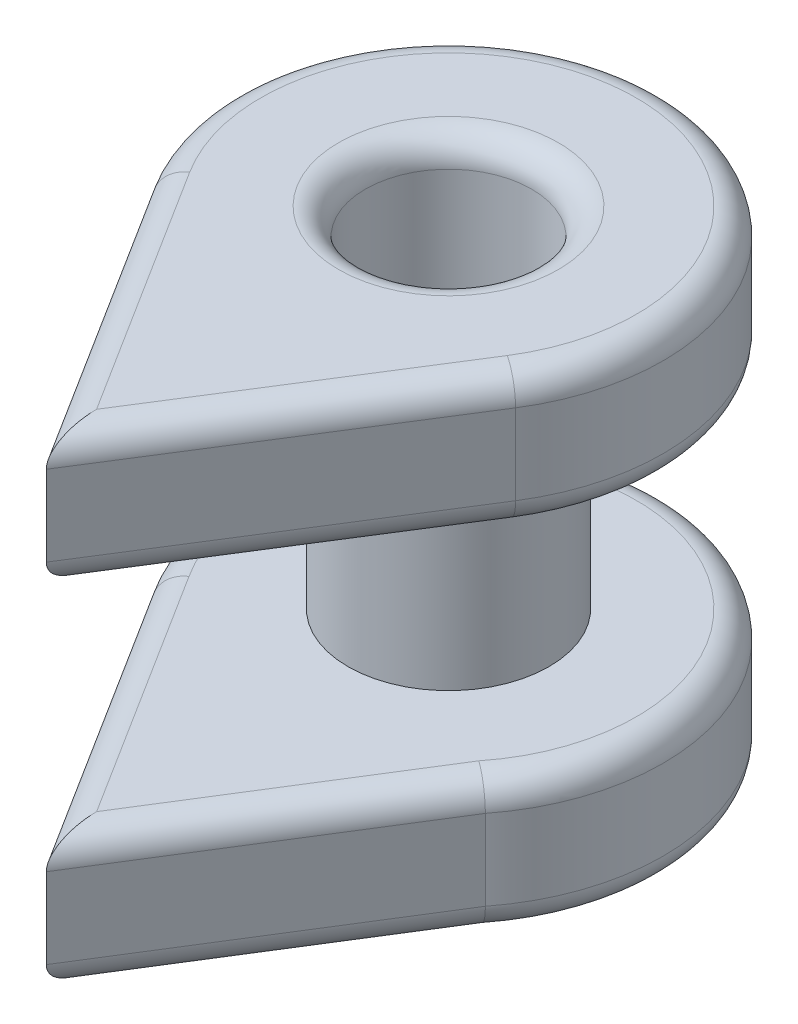
ISO-10303-21;
HEADER;
FILE_DESCRIPTION(('STEP AP214'),'2;1');
FILE_NAME('part.step','',(''),(''),'','','');
FILE_SCHEMA(('AUTOMOTIVE_DESIGN { 1 0 10303 214 1 1 1 1 }'));
ENDSEC;
DATA;
#1=APPLICATION_CONTEXT('core data for automotive mechanical design processes');
#2=APPLICATION_PROTOCOL_DEFINITION('international standard','automotive_design',2000,#1);
#3=PRODUCT_CONTEXT('',#1,'mechanical');
#4=PRODUCT('Part','Part','',(#3));
#5=PRODUCT_RELATED_PRODUCT_CATEGORY('part','',(#4));
#6=PRODUCT_DEFINITION_FORMATION('','',#4);
#7=PRODUCT_DEFINITION_CONTEXT('part definition',#1,'design');
#8=PRODUCT_DEFINITION('design','',#6,#7);
#9=PRODUCT_DEFINITION_SHAPE('','',#8);
#10=(LENGTH_UNIT() NAMED_UNIT(*) SI_UNIT(.MILLI.,.METRE.));
#11=(NAMED_UNIT(*) PLANE_ANGLE_UNIT() SI_UNIT($,.RADIAN.));
#12=(NAMED_UNIT(*) SI_UNIT($,.STERADIAN.) SOLID_ANGLE_UNIT());
#13=UNCERTAINTY_MEASURE_WITH_UNIT(LENGTH_MEASURE(1.E-05),#10,'distance_accuracy_value','');
#14=(GEOMETRIC_REPRESENTATION_CONTEXT(3) GLOBAL_UNCERTAINTY_ASSIGNED_CONTEXT((#13)) GLOBAL_UNIT_ASSIGNED_CONTEXT((#10,
#11,#12)) REPRESENTATION_CONTEXT('',''));
#15=CARTESIAN_POINT('',(0.,0.,0.));
#16=DIRECTION('',(0.,0.,1.));
#17=DIRECTION('',(1.,0.,0.));
#18=AXIS2_PLACEMENT_3D('',#15,#16,#17);
#19=CARTESIAN_POINT('',(0.,8.,0.));
#20=DIRECTION('',(0.,-1.,0.));
#21=DIRECTION('',(0.,0.,-1.));
#22=AXIS2_PLACEMENT_3D('',#19,#20,#21);
#23=CYLINDRICAL_SURFACE('',#22,3.75);
#24=CARTESIAN_POINT('',(0.,8.,0.));
#25=DIRECTION('',(0.,1.,0.));
#26=DIRECTION('',(0.,0.,1.));
#27=AXIS2_PLACEMENT_3D('',#24,#25,#26);
#28=CIRCLE('',#27,3.75);
#29=CARTESIAN_POINT('',(0.,8.,3.75));
#30=VERTEX_POINT('',#29);
#31=EDGE_CURVE('E181',#30,#30,#28,.T.);
#32=ORIENTED_EDGE('',*,*,#31,.F.);
#33=EDGE_LOOP('',(#32));
#34=FACE_BOUND('',#33,.T.);
#35=CARTESIAN_POINT('',(0.,0.,0.));
#36=DIRECTION('',(0.,1.,0.));
#37=DIRECTION('',(0.,0.,1.));
#38=AXIS2_PLACEMENT_3D('',#35,#36,#37);
#39=CIRCLE('',#38,3.75);
#40=CARTESIAN_POINT('',(0.,0.,3.75));
#41=VERTEX_POINT('',#40);
#42=EDGE_CURVE('E163',#41,#41,#39,.T.);
#43=ORIENTED_EDGE('',*,*,#42,.T.);
#44=EDGE_LOOP('',(#43));
#45=FACE_BOUND('',#44,.T.);
#46=ADVANCED_FACE('F45',(#34,#45),#23,.T.);
#47=CARTESIAN_POINT('',(0.,8.,0.));
#48=DIRECTION('',(0.,-1.,0.));
#49=DIRECTION('',(0.,0.,-1.));
#50=AXIS2_PLACEMENT_3D('',#47,#48,#49);
#51=CYLINDRICAL_SURFACE('',#50,3.1);
#52=CARTESIAN_POINT('',(0.,-4.,0.));
#53=DIRECTION('',(0.,-1.,0.));
#54=DIRECTION('',(0.,0.,-1.));
#55=AXIS2_PLACEMENT_3D('',#52,#53,#54);
#56=CIRCLE('',#55,3.1);
#57=CARTESIAN_POINT('',(0.,-4.,-3.1));
#58=VERTEX_POINT('',#57);
#59=EDGE_CURVE('E54',#58,#58,#56,.T.);
#60=ORIENTED_EDGE('',*,*,#59,.T.);
#61=EDGE_LOOP('',(#60));
#62=FACE_BOUND('',#61,.T.);
#63=CARTESIAN_POINT('',(0.,12.,0.));
#64=DIRECTION('',(0.,1.,0.));
#65=DIRECTION('',(0.,0.,1.));
#66=AXIS2_PLACEMENT_3D('',#63,#64,#65);
#67=CIRCLE('',#66,3.1);
#68=CARTESIAN_POINT('',(0.,12.,3.1));
#69=VERTEX_POINT('',#68);
#70=EDGE_CURVE('E633',#69,#69,#67,.T.);
#71=ORIENTED_EDGE('',*,*,#70,.T.);
#72=EDGE_LOOP('',(#71));
#73=FACE_BOUND('',#72,.T.);
#74=ADVANCED_FACE('F307',(#62,#73),#51,.F.);
#75=CARTESIAN_POINT('',(6.76724135490641,13.,4.26666666666667));
#76=DIRECTION('',(-0.845905169363301,0.,-0.533333333333333));
#77=DIRECTION('',(-0.533333333333333,0.,0.845905169363302));
#78=AXIS2_PLACEMENT_3D('',#75,#76,#77);
#79=PLANE('',#78);
#80=DIRECTION('',(0.,-1.,0.));
#81=VECTOR('',#80,1.);
#82=CARTESIAN_POINT('',(0.,13.,15.));
#83=LINE('',#82,#81);
#84=CARTESIAN_POINT('',(0.,12.,15.));
#85=VERTEX_POINT('',#84);
#86=CARTESIAN_POINT('',(0.,9.,15.));
#87=VERTEX_POINT('',#86);
#88=EDGE_CURVE('E143',#85,#87,#83,.T.);
#89=ORIENTED_EDGE('',*,*,#88,.T.);
#90=DIRECTION('',(0.533333333333333,0.,-0.845905169363302));
#91=VECTOR('',#90,1.);
#92=CARTESIAN_POINT('',(6.76724135490641,9.,4.26666666666667));
#93=LINE('',#92,#91);
#94=CARTESIAN_POINT('',(6.76724135490641,9.,4.26666666666667));
#95=VERTEX_POINT('',#94);
#96=EDGE_CURVE('E651',#87,#95,#93,.T.);
#97=ORIENTED_EDGE('',*,*,#96,.T.);
#98=DIRECTION('',(0.,-1.,0.));
#99=VECTOR('',#98,1.);
#100=CARTESIAN_POINT('',(6.76724135490641,13.,4.26666666666667));
#101=LINE('',#100,#99);
#102=CARTESIAN_POINT('',(6.76724135490641,12.,4.26666666666667));
#103=VERTEX_POINT('',#102);
#104=EDGE_CURVE('E145',#103,#95,#101,.T.);
#105=ORIENTED_EDGE('',*,*,#104,.F.);
#106=DIRECTION('',(0.533333333333333,0.,-0.845905169363302));
#107=VECTOR('',#106,1.);
#108=CARTESIAN_POINT('',(0.,12.,15.));
#109=LINE('',#108,#107);
#110=EDGE_CURVE('E139',#103,#85,#109,.F.);
#111=ORIENTED_EDGE('',*,*,#110,.T.);
#112=EDGE_LOOP('',(#89,#97,#105,#111));
#113=FACE_BOUND('',#112,.T.);
#114=ADVANCED_FACE('F141',(#113),#79,.F.);
#115=CARTESIAN_POINT('',(0.,13.,0.));
#116=DIRECTION('',(0.,-1.,0.));
#117=DIRECTION('',(0.,0.,-1.));
#118=AXIS2_PLACEMENT_3D('',#115,#116,#117);
#119=CYLINDRICAL_SURFACE('',#118,8.);
#120=ORIENTED_EDGE('',*,*,#104,.T.);
#121=CARTESIAN_POINT('',(0.,9.,0.));
#122=DIRECTION('',(0.,1.,0.));
#123=DIRECTION('',(0.,0.,1.));
#124=AXIS2_PLACEMENT_3D('',#121,#122,#123);
#125=CIRCLE('',#124,8.);
#126=CARTESIAN_POINT('',(-6.76724135490641,9.,4.26666666666667));
#127=VERTEX_POINT('',#126);
#128=EDGE_CURVE('E61',#95,#127,#125,.T.);
#129=ORIENTED_EDGE('',*,*,#128,.T.);
#130=DIRECTION('',(0.,-1.,0.));
#131=VECTOR('',#130,1.);
#132=CARTESIAN_POINT('',(-6.76724135490641,13.,4.26666666666667));
#133=LINE('',#132,#131);
#134=CARTESIAN_POINT('',(-6.76724135490641,12.,4.26666666666667));
#135=VERTEX_POINT('',#134);
#136=EDGE_CURVE('E162',#135,#127,#133,.T.);
#137=ORIENTED_EDGE('',*,*,#136,.F.);
#138=CARTESIAN_POINT('',(0.,12.,0.));
#139=DIRECTION('',(0.,1.,0.));
#140=DIRECTION('',(0.,0.,1.));
#141=AXIS2_PLACEMENT_3D('',#138,#139,#140);
#142=CIRCLE('',#141,8.);
#143=EDGE_CURVE('E151',#135,#103,#142,.F.);
#144=ORIENTED_EDGE('',*,*,#143,.T.);
#145=EDGE_LOOP('',(#120,#129,#137,#144));
#146=FACE_BOUND('',#145,.T.);
#147=ADVANCED_FACE('F356',(#146),#119,.T.);
#148=CARTESIAN_POINT('',(-6.76724135490641,13.,4.26666666666667));
#149=DIRECTION('',(-0.845905169363301,0.,0.533333333333333));
#150=DIRECTION('',(0.533333333333333,0.,0.845905169363301));
#151=AXIS2_PLACEMENT_3D('',#148,#149,#150);
#152=PLANE('',#151);
#153=ORIENTED_EDGE('',*,*,#136,.T.);
#154=DIRECTION('',(-0.533333333333333,0.,-0.845905169363301));
#155=VECTOR('',#154,1.);
#156=CARTESIAN_POINT('',(0.,9.,15.));
#157=LINE('',#156,#155);
#158=EDGE_CURVE('E160',#127,#87,#157,.F.);
#159=ORIENTED_EDGE('',*,*,#158,.T.);
#160=ORIENTED_EDGE('',*,*,#88,.F.);
#161=DIRECTION('',(-0.533333333333333,0.,-0.845905169363301));
#162=VECTOR('',#161,1.);
#163=CARTESIAN_POINT('',(-6.76724135490641,12.,4.26666666666667));
#164=LINE('',#163,#162);
#165=EDGE_CURVE('E158',#85,#135,#164,.T.);
#166=ORIENTED_EDGE('',*,*,#165,.T.);
#167=EDGE_LOOP('',(#153,#159,#160,#166));
#168=FACE_BOUND('',#167,.T.);
#169=ADVANCED_FACE('F156',(#168),#152,.T.);
#170=CARTESIAN_POINT('',(0.,13.,0.));
#171=DIRECTION('',(0.,1.,0.));
#172=DIRECTION('',(0.,0.,1.));
#173=AXIS2_PLACEMENT_3D('',#170,#171,#172);
#174=PLANE('',#173);
#175=CARTESIAN_POINT('',(0.,13.,0.));
#176=DIRECTION('',(0.,1.,0.));
#177=DIRECTION('',(0.,0.,1.));
#178=AXIS2_PLACEMENT_3D('',#175,#176,#177);
#179=CIRCLE('',#178,4.1);
#180=CARTESIAN_POINT('',(0.,13.,4.1));
#181=VERTEX_POINT('',#180);
#182=EDGE_CURVE('E621',#181,#181,#179,.F.);
#183=ORIENTED_EDGE('',*,*,#182,.T.);
#184=EDGE_LOOP('',(#183));
#185=FACE_BOUND('',#184,.T.);
#186=CARTESIAN_POINT('',(0.,13.,0.));
#187=DIRECTION('',(0.,1.,0.));
#188=DIRECTION('',(0.,0.,1.));
#189=AXIS2_PLACEMENT_3D('',#186,#187,#188);
#190=CIRCLE('',#189,7.);
#191=CARTESIAN_POINT('',(5.92133618554311,13.,3.73333333333333));
#192=VERTEX_POINT('',#191);
#193=CARTESIAN_POINT('',(-5.92133618554311,13.,3.73333333333333));
#194=VERTEX_POINT('',#193);
#195=EDGE_CURVE('E180',#192,#194,#190,.T.);
#196=ORIENTED_EDGE('',*,*,#195,.T.);
#197=DIRECTION('',(-0.533333333333333,0.,-0.845905169363301));
#198=VECTOR('',#197,1.);
#199=CARTESIAN_POINT('',(-5.92133618554311,13.,3.73333333333333));
#200=LINE('',#199,#198);
#201=CARTESIAN_POINT('',(0.,13.,13.125));
#202=VERTEX_POINT('',#201);
#203=EDGE_CURVE('E152',#194,#202,#200,.F.);
#204=ORIENTED_EDGE('',*,*,#203,.T.);
#205=DIRECTION('',(0.533333333333333,0.,-0.845905169363302));
#206=VECTOR('',#205,1.);
#207=CARTESIAN_POINT('',(5.92133618554311,13.,3.73333333333334));
#208=LINE('',#207,#206);
#209=EDGE_CURVE('E168',#202,#192,#208,.T.);
#210=ORIENTED_EDGE('',*,*,#209,.T.);
#211=EDGE_LOOP('',(#196,#204,#210));
#212=FACE_BOUND('',#211,.T.);
#213=ADVANCED_FACE('F346',(#185,#212),#174,.T.);
#214=CARTESIAN_POINT('',(0.,8.,0.));
#215=DIRECTION('',(0.,1.,0.));
#216=DIRECTION('',(0.,0.,1.));
#217=AXIS2_PLACEMENT_3D('',#214,#215,#216);
#218=PLANE('',#217);
#219=CARTESIAN_POINT('',(0.,8.,0.));
#220=DIRECTION('',(0.,1.,0.));
#221=DIRECTION('',(0.,0.,1.));
#222=AXIS2_PLACEMENT_3D('',#219,#220,#221);
#223=CIRCLE('',#222,7.);
#224=CARTESIAN_POINT('',(-5.92133618554311,8.,3.73333333333333));
#225=VERTEX_POINT('',#224);
#226=CARTESIAN_POINT('',(5.92133618554311,8.,3.73333333333333));
#227=VERTEX_POINT('',#226);
#228=EDGE_CURVE('E69',#225,#227,#223,.F.);
#229=ORIENTED_EDGE('',*,*,#228,.T.);
#230=DIRECTION('',(0.533333333333333,0.,-0.845905169363302));
#231=VECTOR('',#230,1.);
#232=CARTESIAN_POINT('',(5.92133618554311,8.,3.73333333333333));
#233=LINE('',#232,#231);
#234=CARTESIAN_POINT('',(0.,8.,13.125));
#235=VERTEX_POINT('',#234);
#236=EDGE_CURVE('E643',#227,#235,#233,.F.);
#237=ORIENTED_EDGE('',*,*,#236,.T.);
#238=DIRECTION('',(-0.533333333333333,0.,-0.845905169363301));
#239=VECTOR('',#238,1.);
#240=CARTESIAN_POINT('',(-5.92133618554311,8.,3.73333333333333));
#241=LINE('',#240,#239);
#242=EDGE_CURVE('E648',#235,#225,#241,.T.);
#243=ORIENTED_EDGE('',*,*,#242,.T.);
#244=EDGE_LOOP('',(#229,#237,#243));
#245=FACE_BOUND('',#244,.T.);
#246=ORIENTED_EDGE('',*,*,#31,.T.);
#247=EDGE_LOOP('',(#246));
#248=FACE_BOUND('',#247,.T.);
#249=ADVANCED_FACE('F349',(#245,#248),#218,.F.);
#250=CARTESIAN_POINT('',(0.,-5.,0.));
#251=DIRECTION('',(0.,-1.,0.));
#252=DIRECTION('',(0.,0.,-1.));
#253=AXIS2_PLACEMENT_3D('',#250,#251,#252);
#254=PLANE('',#253);
#255=CARTESIAN_POINT('',(0.,-5.,0.));
#256=DIRECTION('',(0.,-1.,0.));
#257=DIRECTION('',(0.,0.,-1.));
#258=AXIS2_PLACEMENT_3D('',#255,#256,#257);
#259=CIRCLE('',#258,4.1);
#260=CARTESIAN_POINT('',(0.,-5.,-4.1));
#261=VERTEX_POINT('',#260);
#262=EDGE_CURVE('E11',#261,#261,#259,.F.);
#263=ORIENTED_EDGE('',*,*,#262,.T.);
#264=EDGE_LOOP('',(#263));
#265=FACE_BOUND('',#264,.T.);
#266=CARTESIAN_POINT('',(0.,-5.,0.));
#267=DIRECTION('',(0.,-1.,0.));
#268=DIRECTION('',(0.,0.,-1.));
#269=AXIS2_PLACEMENT_3D('',#266,#267,#268);
#270=CIRCLE('',#269,7.);
#271=CARTESIAN_POINT('',(-5.87806323233719,-5.,3.80110150307061));
#272=VERTEX_POINT('',#271);
#273=CARTESIAN_POINT('',(5.48222327253751,-5.,4.3526116286717));
#274=VERTEX_POINT('',#273);
#275=EDGE_CURVE('E196',#272,#274,#270,.T.);
#276=ORIENTED_EDGE('',*,*,#275,.T.);
#277=DIRECTION('',(-0.530411815651558,0.,0.847740116909196));
#278=VECTOR('',#277,1.);
#279=CARTESIAN_POINT('',(-0.847740116909194,-5.,14.4695881843484));
#280=LINE('',#279,#278);
#281=CARTESIAN_POINT('',(-0.0032088879328749,-5.,13.1198011289707));
#282=VERTEX_POINT('',#281);
#283=EDGE_CURVE('E208',#274,#282,#280,.T.);
#284=ORIENTED_EDGE('',*,*,#283,.T.);
#285=DIRECTION('',(-0.533302350629562,0.,-0.845924702803379));
#286=VECTOR('',#285,1.);
#287=CARTESIAN_POINT('',(-5.875093060499,-5.,3.80581279250434));
#288=LINE('',#287,#286);
#289=EDGE_CURVE('E205',#282,#272,#288,.T.);
#290=ORIENTED_EDGE('',*,*,#289,.T.);
#291=EDGE_LOOP('',(#276,#284,#290));
#292=FACE_BOUND('',#291,.T.);
#293=ADVANCED_FACE('F353',(#265,#292),#254,.T.);
#294=CARTESIAN_POINT('',(0.,0.,0.));
#295=DIRECTION('',(0.,-1.,0.));
#296=DIRECTION('',(0.,0.,-1.));
#297=AXIS2_PLACEMENT_3D('',#294,#295,#296);
#298=PLANE('',#297);
#299=DIRECTION('',(-0.533302350629562,0.,-0.845924702803379));
#300=VECTOR('',#299,1.);
#301=CARTESIAN_POINT('',(-5.92107978410645,0.,3.73286860717568));
#302=LINE('',#301,#300);
#303=CARTESIAN_POINT('',(-5.87806323233722,0.,3.80110150307057));
#304=VERTEX_POINT('',#303);
#305=CARTESIAN_POINT('',(-0.00320888793287546,0.,13.1198011289707));
#306=VERTEX_POINT('',#305);
#307=EDGE_CURVE('E666',#304,#306,#302,.F.);
#308=ORIENTED_EDGE('',*,*,#307,.T.);
#309=DIRECTION('',(-0.530411815651558,0.,0.847740116909196));
#310=VECTOR('',#309,1.);
#311=CARTESIAN_POINT('',(5.89703050224787,0.,3.68963859709018));
#312=LINE('',#311,#310);
#313=CARTESIAN_POINT('',(5.48222327253751,0.,4.3526116286717));
#314=VERTEX_POINT('',#313);
#315=EDGE_CURVE('E659',#306,#314,#312,.F.);
#316=ORIENTED_EDGE('',*,*,#315,.T.);
#317=CARTESIAN_POINT('',(0.,0.,0.));
#318=DIRECTION('',(0.,-1.,0.));
#319=DIRECTION('',(0.,0.,-1.));
#320=AXIS2_PLACEMENT_3D('',#317,#318,#319);
#321=CIRCLE('',#320,7.);
#322=EDGE_CURVE('E663',#314,#304,#321,.F.);
#323=ORIENTED_EDGE('',*,*,#322,.T.);
#324=EDGE_LOOP('',(#308,#316,#323));
#325=FACE_BOUND('',#324,.T.);
#326=ORIENTED_EDGE('',*,*,#42,.F.);
#327=EDGE_LOOP('',(#326));
#328=FACE_BOUND('',#327,.T.);
#329=ADVANCED_FACE('F340',(#325,#328),#298,.F.);
#330=CARTESIAN_POINT('',(0.,-5.,15.));
#331=DIRECTION('',(0.845924702803379,0.,-0.533302350629562));
#332=DIRECTION('',(-0.533302350629562,0.,-0.845924702803379));
#333=AXIS2_PLACEMENT_3D('',#330,#331,#332);
#334=PLANE('',#333);
#335=DIRECTION('',(0.,1.,0.));
#336=VECTOR('',#335,1.);
#337=CARTESIAN_POINT('',(0.,-5.,15.));
#338=LINE('',#337,#336);
#339=CARTESIAN_POINT('',(0.,-4.,15.));
#340=VERTEX_POINT('',#339);
#341=CARTESIAN_POINT('',(0.,-1.,15.));
#342=VERTEX_POINT('',#341);
#343=EDGE_CURVE('E202',#340,#342,#338,.T.);
#344=ORIENTED_EDGE('',*,*,#343,.T.);
#345=DIRECTION('',(-0.533302350629562,0.,-0.845924702803379));
#346=VECTOR('',#345,1.);
#347=CARTESIAN_POINT('',(0.,-1.,15.));
#348=LINE('',#347,#346);
#349=CARTESIAN_POINT('',(-6.72101776330238,-1.,4.3391151431339));
#350=VERTEX_POINT('',#349);
#351=EDGE_CURVE('E654',#342,#350,#348,.T.);
#352=ORIENTED_EDGE('',*,*,#351,.T.);
#353=DIRECTION('',(0.,1.,0.));
#354=VECTOR('',#353,1.);
#355=CARTESIAN_POINT('',(-6.72101776330238,-5.,4.3391151431339));
#356=LINE('',#355,#354);
#357=CARTESIAN_POINT('',(-6.72101776330238,-4.,4.3391151431339));
#358=VERTEX_POINT('',#357);
#359=EDGE_CURVE('E602',#358,#350,#356,.T.);
#360=ORIENTED_EDGE('',*,*,#359,.F.);
#361=DIRECTION('',(-0.533302350629562,0.,-0.845924702803379));
#362=VECTOR('',#361,1.);
#363=CARTESIAN_POINT('',(0.,-4.,15.));
#364=LINE('',#363,#362);
#365=EDGE_CURVE('E216',#358,#340,#364,.F.);
#366=ORIENTED_EDGE('',*,*,#365,.T.);
#367=EDGE_LOOP('',(#344,#352,#360,#366));
#368=FACE_BOUND('',#367,.T.);
#369=ADVANCED_FACE('F335',(#368),#334,.F.);
#370=CARTESIAN_POINT('',(0.,-5.,0.));
#371=DIRECTION('',(0.,1.,0.));
#372=DIRECTION('',(0.,0.,1.));
#373=AXIS2_PLACEMENT_3D('',#370,#371,#372);
#374=CYLINDRICAL_SURFACE('',#373,8.);
#375=ORIENTED_EDGE('',*,*,#359,.T.);
#376=CARTESIAN_POINT('',(0.,-1.,0.));
#377=DIRECTION('',(0.,-1.,0.));
#378=DIRECTION('',(0.,0.,-1.));
#379=AXIS2_PLACEMENT_3D('',#376,#377,#378);
#380=CIRCLE('',#379,8.);
#381=CARTESIAN_POINT('',(6.30123601890993,-1.,4.92893747515549));
#382=VERTEX_POINT('',#381);
#383=EDGE_CURVE('E600',#350,#382,#380,.T.);
#384=ORIENTED_EDGE('',*,*,#383,.T.);
#385=DIRECTION('',(0.,1.,0.));
#386=VECTOR('',#385,1.);
#387=CARTESIAN_POINT('',(6.30123601890993,-5.,4.92893747515549));
#388=LINE('',#387,#386);
#389=CARTESIAN_POINT('',(6.30123601890993,-4.,4.92893747515549));
#390=VERTEX_POINT('',#389);
#391=EDGE_CURVE('E596',#390,#382,#388,.T.);
#392=ORIENTED_EDGE('',*,*,#391,.F.);
#393=CARTESIAN_POINT('',(0.,-4.,0.));
#394=DIRECTION('',(0.,-1.,0.));
#395=DIRECTION('',(0.,0.,-1.));
#396=AXIS2_PLACEMENT_3D('',#393,#394,#395);
#397=CIRCLE('',#396,8.);
#398=EDGE_CURVE('E219',#390,#358,#397,.F.);
#399=ORIENTED_EDGE('',*,*,#398,.T.);
#400=EDGE_LOOP('',(#375,#384,#392,#399));
#401=FACE_BOUND('',#400,.T.);
#402=ADVANCED_FACE('F329',(#401),#374,.T.);
#403=CARTESIAN_POINT('',(0.,-5.,15.));
#404=DIRECTION('',(-0.847740116909196,0.,-0.530411815651558));
#405=DIRECTION('',(-0.530411815651558,0.,0.847740116909196));
#406=AXIS2_PLACEMENT_3D('',#403,#404,#405);
#407=PLANE('',#406);
#408=ORIENTED_EDGE('',*,*,#391,.T.);
#409=DIRECTION('',(-0.530411815651558,0.,0.847740116909196));
#410=VECTOR('',#409,1.);
#411=CARTESIAN_POINT('',(0.,-1.,15.));
#412=LINE('',#411,#410);
#413=EDGE_CURVE('E222',#382,#342,#412,.T.);
#414=ORIENTED_EDGE('',*,*,#413,.T.);
#415=ORIENTED_EDGE('',*,*,#343,.F.);
#416=DIRECTION('',(-0.530411815651558,0.,0.847740116909196));
#417=VECTOR('',#416,1.);
#418=CARTESIAN_POINT('',(6.30123601890993,-4.,4.92893747515549));
#419=LINE('',#418,#417);
#420=EDGE_CURVE('E212',#340,#390,#419,.F.);
#421=ORIENTED_EDGE('',*,*,#420,.T.);
#422=EDGE_LOOP('',(#408,#414,#415,#421));
#423=FACE_BOUND('',#422,.T.);
#424=ADVANCED_FACE('F325',(#423),#407,.F.);
#425=CARTESIAN_POINT('',(5.92133618554311,12.,3.73333333333333));
#426=DIRECTION('',(-0.533333333333333,0.,0.845905169363302));
#427=DIRECTION('',(0.845905169363302,0.,0.533333333333333));
#428=AXIS2_PLACEMENT_3D('',#425,#426,#427);
#429=CYLINDRICAL_SURFACE('',#428,1.);
#430=CARTESIAN_POINT('',(0.,12.,13.125));
#431=DIRECTION('',(-1.,0.,0.));
#432=DIRECTION('',(0.,0.,1.));
#433=AXIS2_PLACEMENT_3D('',#430,#431,#432);
#434=ELLIPSE('',#433,1.875,1.);
#435=EDGE_CURVE('E166',#85,#202,#434,.T.);
#436=ORIENTED_EDGE('',*,*,#435,.F.);
#437=ORIENTED_EDGE('',*,*,#110,.F.);
#438=CARTESIAN_POINT('',(5.92133618554311,12.,3.73333333333333));
#439=DIRECTION('',(0.533333333333334,0.,-0.845905169363301));
#440=DIRECTION('',(-0.845905169363301,0.,-0.533333333333334));
#441=AXIS2_PLACEMENT_3D('',#438,#439,#440);
#442=CIRCLE('',#441,1.);
#443=EDGE_CURVE('E173',#192,#103,#442,.T.);
#444=ORIENTED_EDGE('',*,*,#443,.F.);
#445=ORIENTED_EDGE('',*,*,#209,.F.);
#446=EDGE_LOOP('',(#436,#437,#444,#445));
#447=FACE_BOUND('',#446,.T.);
#448=ADVANCED_FACE('F167',(#447),#429,.T.);
#449=CARTESIAN_POINT('',(0.,12.,0.));
#450=DIRECTION('',(0.,1.,0.));
#451=DIRECTION('',(0.,0.,1.));
#452=AXIS2_PLACEMENT_3D('',#449,#450,#451);
#453=TOROIDAL_SURFACE('',#452,7.,1.);
#454=ORIENTED_EDGE('',*,*,#443,.T.);
#455=ORIENTED_EDGE('',*,*,#143,.F.);
#456=CARTESIAN_POINT('',(-5.92133618554311,12.,3.73333333333333));
#457=DIRECTION('',(0.533333333333334,0.,0.845905169363301));
#458=DIRECTION('',(0.845905169363301,0.,-0.533333333333334));
#459=AXIS2_PLACEMENT_3D('',#456,#457,#458);
#460=CIRCLE('',#459,1.);
#461=EDGE_CURVE('E174',#194,#135,#460,.T.);
#462=ORIENTED_EDGE('',*,*,#461,.F.);
#463=ORIENTED_EDGE('',*,*,#195,.F.);
#464=EDGE_LOOP('',(#454,#455,#462,#463));
#465=FACE_BOUND('',#464,.T.);
#466=ADVANCED_FACE('F321',(#465),#453,.T.);
#467=CARTESIAN_POINT('',(-5.92133618554311,12.,3.73333333333333));
#468=DIRECTION('',(-0.533333333333333,0.,-0.845905169363301));
#469=DIRECTION('',(-0.845905169363301,0.,0.533333333333333));
#470=AXIS2_PLACEMENT_3D('',#467,#468,#469);
#471=CYLINDRICAL_SURFACE('',#470,1.);
#472=ORIENTED_EDGE('',*,*,#435,.T.);
#473=ORIENTED_EDGE('',*,*,#203,.F.);
#474=ORIENTED_EDGE('',*,*,#461,.T.);
#475=ORIENTED_EDGE('',*,*,#165,.F.);
#476=EDGE_LOOP('',(#472,#473,#474,#475));
#477=FACE_BOUND('',#476,.T.);
#478=ADVANCED_FACE('F176',(#477),#471,.T.);
#479=CARTESIAN_POINT('',(0.,-4.,0.));
#480=DIRECTION('',(0.,-1.,0.));
#481=DIRECTION('',(0.,0.,-1.));
#482=AXIS2_PLACEMENT_3D('',#479,#480,#481);
#483=TOROIDAL_SURFACE('',#482,7.,1.);
#484=CARTESIAN_POINT('',(6.30123601890993,-4.,4.92893747515549));
#485=CARTESIAN_POINT('',(6.30123589369127,-4.02810523337649,4.92893736002015));
#486=CARTESIAN_POINT('',(6.30026389176612,-4.05619699222764,4.92825594729535));
#487=CARTESIAN_POINT('',(6.2963863692116,-4.1121793027964,4.92553746912775));
#488=CARTESIAN_POINT('',(6.2934809460685,-4.14006986458702,4.92350047203572));
#489=CARTESIAN_POINT('',(6.28189226228523,-4.22309299794642,4.91537518784513));
#490=CARTESIAN_POINT('',(6.27033651089603,-4.2776690846557,4.90727255568994));
#491=CARTESIAN_POINT('',(6.23989050963043,-4.38367482901325,4.88591929616552));
#492=CARTESIAN_POINT('',(6.22099685213045,-4.43510301195445,4.87266627702499));
#493=CARTESIAN_POINT('',(6.17642123431394,-4.5333536242556,4.84138799422));
#494=CARTESIAN_POINT('',(6.15074082514501,-4.58017710269377,4.82336382102621));
#495=CARTESIAN_POINT('',(6.09331154747823,-4.66792199689854,4.78303911108742));
#496=CARTESIAN_POINT('',(6.06155947222426,-4.70884027369861,4.76073631456318));
#497=CARTESIAN_POINT('',(5.99289000349859,-4.78360685312147,4.7124781863009));
#498=CARTESIAN_POINT('',(5.95597081808732,-4.81745269284745,4.68652158741615));
#499=CARTESIAN_POINT('',(5.87797311032855,-4.87715046223828,4.63165246481711));
#500=CARTESIAN_POINT('',(5.83688803406113,-4.90298952804544,4.60273528269712));
#501=CARTESIAN_POINT('',(5.75179228331446,-4.94585686357876,4.54280344792681));
#502=CARTESIAN_POINT('',(5.70778431579756,-4.96289316082435,4.51179073554962));
#503=CARTESIAN_POINT('',(5.63582244851782,-4.98281216154913,4.4610440782292));
#504=CARTESIAN_POINT('',(5.60837874506976,-4.98862688532013,4.44168332851447));
#505=CARTESIAN_POINT('',(5.55318447386819,-4.99680812514956,4.40272886763474));
#506=CARTESIAN_POINT('',(5.52543442425252,-4.99917976597158,4.38313554655185));
#507=CARTESIAN_POINT('',(5.4925261701903,-4.99994063753675,4.35989015914956));
#508=CARTESIAN_POINT('',(5.48737430074516,-5.00000015846302,4.35625074393694));
#509=CARTESIAN_POINT('',(5.48222327253898,-5.,4.35261162866986));
#510=B_SPLINE_CURVE_WITH_KNOTS('',3,(#484,#485,#486,#487,#488,#489,#490,#491,#492,#493,#494,
#495,#496,#497,#498,#499,#500,#501,#502,#503,#504,#505,#506,#507,#508,#509),.UNSPECIFIED.,.F.,
.F.,(4,2,2,2,2,2,2,2,2,2,2,2,4),(0.,0.0842638796952154,0.168523510989591,0.336770089675984,
0.505094893383064,0.673381258797319,0.841756751534247,1.01019078178753,1.17889403532536,
1.34744317036611,1.44954886605918,1.55150242892722,1.57042507080788),.UNSPECIFIED.);
#511=EDGE_CURVE('E226',#274,#390,#510,.F.);
#512=ORIENTED_EDGE('',*,*,#511,.F.);
#513=ORIENTED_EDGE('',*,*,#275,.F.);
#514=CARTESIAN_POINT('',(-6.72101776330238,-4.,4.3391151431339));
#515=CARTESIAN_POINT('',(-6.72101760608329,-4.0281333174284,4.33911504009044));
#516=CARTESIAN_POINT('',(-6.72001624407372,-4.0562531557634,4.3384761797444));
#517=CARTESIAN_POINT('',(-6.71602141067577,-4.11229162941648,4.33592749260345));
#518=CARTESIAN_POINT('',(-6.71302803459132,-4.14021027429567,4.3340177266125));
#519=CARTESIAN_POINT('',(-6.70108769636544,-4.22332007217792,4.3263997786395));
#520=CARTESIAN_POINT('',(-6.68918044963741,-4.27795447883036,4.31880289919155));
#521=CARTESIAN_POINT('',(-6.65780268153007,-4.38407505280945,4.29878321343662));
#522=CARTESIAN_POINT('',(-6.6383285010879,-4.43555968306959,4.28635807237754));
#523=CARTESIAN_POINT('',(-6.5923740790975,-4.53391395876904,4.25703664331158));
#524=CARTESIAN_POINT('',(-6.56589568810939,-4.58078481871628,4.24014153629992));
#525=CARTESIAN_POINT('',(-6.50668627854462,-4.66858304803981,4.20235998243709));
#526=CARTESIAN_POINT('',(-6.47395581228651,-4.70951094186571,4.18147388815622));
#527=CARTESIAN_POINT('',(-6.40315125639289,-4.78428693553855,4.13628936299964));
#528=CARTESIAN_POINT('',(-6.36507475194591,-4.81813181867935,4.11198939006804));
#529=CARTESIAN_POINT('',(-6.28466058770545,-4.87776978231805,4.0606668590926));
#530=CARTESIAN_POINT('',(-6.24232085910542,-4.9035589284805,4.03364297921699));
#531=CARTESIAN_POINT('',(-6.15462756099005,-4.94630506141714,3.97766776839533));
#532=CARTESIAN_POINT('',(-6.1092782927981,-4.96327435975996,3.94871918818268));
#533=CARTESIAN_POINT('',(-6.04082788136878,-4.98155316307888,3.90502086887199));
#534=CARTESIAN_POINT('',(-6.01836153730012,-4.9864218656307,3.89067800232894));
#535=CARTESIAN_POINT('',(-5.97318793245838,-4.99397828341885,3.86183743494031));
#536=CARTESIAN_POINT('',(-5.9504809558866,-4.99666833198427,3.84733991663715));
#537=CARTESIAN_POINT('',(-5.91118624820831,-4.99942141399153,3.8222508675646));
#538=CARTESIAN_POINT('',(-5.89462308517766,-5.00000164995521,3.81167527189722));
#539=CARTESIAN_POINT('',(-5.87806323233736,-5.,3.80110150307037));
#540=B_SPLINE_CURVE_WITH_KNOTS('',3,(#514,#515,#516,#517,#518,#519,#520,#521,#522,#523,#524,
#525,#526,#527,#528,#529,#530,#531,#532,#533,#534,#535,#536,#537,#538,#539),.UNSPECIFIED.,.F.,
.F.,(4,2,2,2,2,2,2,2,2,2,2,2,4),(0.,0.0843481113037146,0.168692187430667,0.33711558170892,
0.505620520281324,0.674080983091247,0.842526570704997,1.01104849164154,1.17965258865531,
1.3480206959,1.42923521926331,1.51036264676823,1.56930624559193),.UNSPECIFIED.);
#541=EDGE_CURVE('E198',#358,#272,#540,.T.);
#542=ORIENTED_EDGE('',*,*,#541,.F.);
#543=ORIENTED_EDGE('',*,*,#398,.F.);
#544=EDGE_LOOP('',(#512,#513,#542,#543));
#545=FACE_BOUND('',#544,.T.);
#546=ADVANCED_FACE('F245',(#545),#483,.T.);
#547=CARTESIAN_POINT('',(-5.92107978410645,-4.,3.73286860717568));
#548=DIRECTION('',(0.533302350629562,0.,0.845924702803379));
#549=DIRECTION('',(0.845924702803379,0.,-0.533302350629562));
#550=AXIS2_PLACEMENT_3D('',#547,#548,#549);
#551=CYLINDRICAL_SURFACE('',#550,1.);
#552=ORIENTED_EDGE('',*,*,#541,.T.);
#553=ORIENTED_EDGE('',*,*,#289,.F.);
#554=CARTESIAN_POINT('',(-0.003208887932875,-4.,13.1198011289707));
#555=DIRECTION('',(0.999998543633835,0.,-0.0017066722616443));
#556=DIRECTION('',(0.00170667226164445,0.,0.999998543633835));
#557=AXIS2_PLACEMENT_3D('',#554,#555,#556);
#558=ELLIPSE('',#557,1.88020160929126,1.);
#559=EDGE_CURVE('E223',#340,#282,#558,.T.);
#560=ORIENTED_EDGE('',*,*,#559,.F.);
#561=ORIENTED_EDGE('',*,*,#365,.F.);
#562=EDGE_LOOP('',(#552,#553,#560,#561));
#563=FACE_BOUND('',#562,.T.);
#564=ADVANCED_FACE('F248',(#563),#551,.T.);
#565=CARTESIAN_POINT('',(5.89703050224787,-4.,3.68963859709018));
#566=DIRECTION('',(0.530411815651558,0.,-0.847740116909196));
#567=DIRECTION('',(-0.847740116909196,0.,-0.530411815651558));
#568=AXIS2_PLACEMENT_3D('',#565,#566,#567);
#569=CYLINDRICAL_SURFACE('',#568,1.);
#570=ORIENTED_EDGE('',*,*,#511,.T.);
#571=ORIENTED_EDGE('',*,*,#420,.F.);
#572=ORIENTED_EDGE('',*,*,#559,.T.);
#573=ORIENTED_EDGE('',*,*,#283,.F.);
#574=EDGE_LOOP('',(#570,#571,#572,#573));
#575=FACE_BOUND('',#574,.T.);
#576=ADVANCED_FACE('F242',(#575),#569,.T.);
#577=CARTESIAN_POINT('',(0.,-1.,0.));
#578=DIRECTION('',(0.,-1.,0.));
#579=DIRECTION('',(0.,0.,-1.));
#580=AXIS2_PLACEMENT_3D('',#577,#578,#579);
#581=TOROIDAL_SURFACE('',#580,7.,1.);
#582=CARTESIAN_POINT('',(6.30123601890993,-1.,4.92893747515549));
#583=CARTESIAN_POINT('',(6.30123589369127,-0.97189476662351,4.92893736002015));
#584=CARTESIAN_POINT('',(6.30026389176612,-0.943803007772361,4.92825594729535));
#585=CARTESIAN_POINT('',(6.2963863692116,-0.887820697203602,4.92553746912775));
#586=CARTESIAN_POINT('',(6.2934809460685,-0.859930135412975,4.92350047203572));
#587=CARTESIAN_POINT('',(6.28189226228523,-0.776907002053581,4.91537518784513));
#588=CARTESIAN_POINT('',(6.27033651089602,-0.722330915344298,4.90727255568994));
#589=CARTESIAN_POINT('',(6.23989050963043,-0.616325170986749,4.88591929616553));
#590=CARTESIAN_POINT('',(6.22099685213044,-0.564896988045551,4.872666277025));
#591=CARTESIAN_POINT('',(6.17642123431393,-0.466646375744399,4.84138799422001));
#592=CARTESIAN_POINT('',(6.150740825145,-0.41982289730623,4.82336382102622));
#593=CARTESIAN_POINT('',(6.09331154747822,-0.33207800310146,4.78303911108742));
#594=CARTESIAN_POINT('',(6.06155947222427,-0.291159726301392,4.76073631456317));
#595=CARTESIAN_POINT('',(5.9928900034986,-0.216393146878531,4.71247818630089));
#596=CARTESIAN_POINT('',(5.95597081808732,-0.182547307152551,4.68652158741615));
#597=CARTESIAN_POINT('',(5.87797311032855,-0.122849537761722,4.63165246481712));
#598=CARTESIAN_POINT('',(5.83688803406114,-0.0970104719545565,4.60273528269711));
#599=CARTESIAN_POINT('',(5.75179228331446,-0.0541431364212414,4.5428034479268));
#600=CARTESIAN_POINT('',(5.70778431579756,-0.0371068391756454,4.51179073554963));
#601=CARTESIAN_POINT('',(5.63582244851782,-0.0171878384508723,4.4610440782292));
#602=CARTESIAN_POINT('',(5.60837874506977,-0.0113731146798713,4.44168332851446));
#603=CARTESIAN_POINT('',(5.55318447386821,-0.00319187485043909,4.40272886763474));
#604=CARTESIAN_POINT('',(5.52543442425254,-0.000820234028418129,4.38313554655184));
#605=CARTESIAN_POINT('',(5.49252617019032,-5.93624632535075E-05,4.35989015914957));
#606=CARTESIAN_POINT('',(5.48737430074517,1.58463020471659E-07,4.35625074393694));
#607=CARTESIAN_POINT('',(5.48222327253899,0.,4.35261162866987));
#608=B_SPLINE_CURVE_WITH_KNOTS('',3,(#582,#583,#584,#585,#586,#587,#588,#589,#590,#591,#592,
#593,#594,#595,#596,#597,#598,#599,#600,#601,#602,#603,#604,#605,#606,#607),.UNSPECIFIED.,.F.,
.F.,(4,2,2,2,2,2,2,2,2,2,2,2,4),(0.,0.0842638796952155,0.168523510989591,0.336770089675984,
0.505094893383065,0.67338125879732,0.841756751534248,1.01019078178753,1.17889403532536,
1.34744317036611,1.44954886605917,1.5515024289272,1.57042507080786),.UNSPECIFIED.);
#609=EDGE_CURVE('E266',#382,#314,#608,.T.);
#610=ORIENTED_EDGE('',*,*,#609,.F.);
#611=ORIENTED_EDGE('',*,*,#383,.F.);
#612=CARTESIAN_POINT('',(-6.72101776330238,-1.,4.3391151431339));
#613=CARTESIAN_POINT('',(-6.72101760608335,-0.971866682571604,4.33911504009034));
#614=CARTESIAN_POINT('',(-6.72001624407379,-0.943746844236601,4.33847617974429));
#615=CARTESIAN_POINT('',(-6.7160214106758,-0.88770837058352,4.3359274926034));
#616=CARTESIAN_POINT('',(-6.71302803459131,-0.859789725704334,4.3340177266125));
#617=CARTESIAN_POINT('',(-6.70108769636536,-0.776679927822074,4.32639977863962));
#618=CARTESIAN_POINT('',(-6.68918044963734,-0.722045521169634,4.31880289919166));
#619=CARTESIAN_POINT('',(-6.65780268152999,-0.615924947190545,4.29878321343673));
#620=CARTESIAN_POINT('',(-6.6383285010878,-0.564440316930401,4.28635807237769));
#621=CARTESIAN_POINT('',(-6.59237407909746,-0.466086041230957,4.25703664331163));
#622=CARTESIAN_POINT('',(-6.56589568810943,-0.419215181283714,4.24014153629985));
#623=CARTESIAN_POINT('',(-6.50668627854469,-0.331416951960182,4.20235998243697));
#624=CARTESIAN_POINT('',(-6.47395581228654,-0.290489058134283,4.18147388815617));
#625=CARTESIAN_POINT('',(-6.40315125639289,-0.215713064461451,4.13628936299963));
#626=CARTESIAN_POINT('',(-6.36507475194593,-0.181868181320647,4.11198939006801));
#627=CARTESIAN_POINT('',(-6.28466058770548,-0.122230217681946,4.06066685909255));
#628=CARTESIAN_POINT('',(-6.24232085910545,-0.0964410715194988,4.03364297921693));
#629=CARTESIAN_POINT('',(-6.15462756099004,-0.0536949385828577,3.97766776839534));
#630=CARTESIAN_POINT('',(-6.10927829279804,-0.0367256402400425,3.94871918818275));
#631=CARTESIAN_POINT('',(-6.04082788136878,-0.0184468369211388,3.90502086887211));
#632=CARTESIAN_POINT('',(-6.0183615373002,-0.0135781343693292,3.89067800232908));
#633=CARTESIAN_POINT('',(-5.97318793245867,-0.00602171658118968,3.86183743494043));
#634=CARTESIAN_POINT('',(-5.95048095588702,-0.00333166801576315,3.84733991663721));
#635=CARTESIAN_POINT('',(-5.91118624820879,-0.000578586008491209,3.8222508675647));
#636=CARTESIAN_POINT('',(-5.89462308517809,1.64995520294842E-06,3.81167527189737));
#637=CARTESIAN_POINT('',(-5.87806323233768,0.,3.80110150307069));
#638=B_SPLINE_CURVE_WITH_KNOTS('',3,(#612,#613,#614,#615,#616,#617,#618,#619,#620,#621,#622,
#623,#624,#625,#626,#627,#628,#629,#630,#631,#632,#633,#634,#635,#636,#637),.UNSPECIFIED.,.F.,
.F.,(4,2,2,2,2,2,2,2,2,2,2,2,4),(0.,0.0843481113037151,0.168692187430668,0.337115581708923,
0.50562052028133,0.674080983091254,0.842526570705002,1.01104849164154,1.17965258865532,
1.34802069590001,1.42923521926308,1.51036264676776,1.56930624559149),.UNSPECIFIED.);
#639=EDGE_CURVE('E227',#304,#350,#638,.F.);
#640=ORIENTED_EDGE('',*,*,#639,.F.);
#641=ORIENTED_EDGE('',*,*,#322,.F.);
#642=EDGE_LOOP('',(#610,#611,#640,#641));
#643=FACE_BOUND('',#642,.T.);
#644=ADVANCED_FACE('F255',(#643),#581,.T.);
#645=CARTESIAN_POINT('',(0.84592470280338,-1.,14.4666976493704));
#646=DIRECTION('',(-0.533302350629562,0.,-0.845924702803379));
#647=DIRECTION('',(-0.845924702803379,0.,0.533302350629562));
#648=AXIS2_PLACEMENT_3D('',#645,#646,#647);
#649=CYLINDRICAL_SURFACE('',#648,1.);
#650=ORIENTED_EDGE('',*,*,#639,.T.);
#651=ORIENTED_EDGE('',*,*,#351,.F.);
#652=CARTESIAN_POINT('',(-0.00320888793287489,-1.,13.1198011289707));
#653=DIRECTION('',(-0.999998543633835,0.,0.0017066722616443));
#654=DIRECTION('',(-0.00170667226164445,0.,-0.999998543633835));
#655=AXIS2_PLACEMENT_3D('',#652,#653,#654);
#656=ELLIPSE('',#655,1.88020160929126,1.);
#657=EDGE_CURVE('E625',#306,#342,#656,.F.);
#658=ORIENTED_EDGE('',*,*,#657,.F.);
#659=ORIENTED_EDGE('',*,*,#307,.F.);
#660=EDGE_LOOP('',(#650,#651,#658,#659));
#661=FACE_BOUND('',#660,.T.);
#662=ADVANCED_FACE('F259',(#661),#649,.T.);
#663=CARTESIAN_POINT('',(-0.847740116909194,-1.,14.4695881843484));
#664=DIRECTION('',(-0.530411815651558,0.,0.847740116909196));
#665=DIRECTION('',(0.847740116909196,0.,0.530411815651558));
#666=AXIS2_PLACEMENT_3D('',#663,#664,#665);
#667=CYLINDRICAL_SURFACE('',#666,1.);
#668=ORIENTED_EDGE('',*,*,#609,.T.);
#669=ORIENTED_EDGE('',*,*,#315,.F.);
#670=ORIENTED_EDGE('',*,*,#657,.T.);
#671=ORIENTED_EDGE('',*,*,#413,.F.);
#672=EDGE_LOOP('',(#668,#669,#670,#671));
#673=FACE_BOUND('',#672,.T.);
#674=ADVANCED_FACE('F261',(#673),#667,.T.);
#675=CARTESIAN_POINT('',(-5.92133618554311,9.,3.73333333333333));
#676=DIRECTION('',(0.533333333333333,0.,0.845905169363301));
#677=DIRECTION('',(0.845905169363301,0.,-0.533333333333333));
#678=AXIS2_PLACEMENT_3D('',#675,#676,#677);
#679=CYLINDRICAL_SURFACE('',#678,1.);
#680=CARTESIAN_POINT('',(0.,9.,13.125));
#681=DIRECTION('',(1.,0.,0.));
#682=DIRECTION('',(0.,0.,1.));
#683=AXIS2_PLACEMENT_3D('',#680,#681,#682);
#684=ELLIPSE('',#683,1.875,1.);
#685=EDGE_CURVE('E618',#87,#235,#684,.T.);
#686=ORIENTED_EDGE('',*,*,#685,.F.);
#687=ORIENTED_EDGE('',*,*,#158,.F.);
#688=CARTESIAN_POINT('',(-5.92133618554311,9.,3.73333333333333));
#689=DIRECTION('',(-0.533333333333334,0.,-0.845905169363301));
#690=DIRECTION('',(-0.845905169363301,0.,0.533333333333334));
#691=AXIS2_PLACEMENT_3D('',#688,#689,#690);
#692=CIRCLE('',#691,1.);
#693=EDGE_CURVE('E617',#225,#127,#692,.T.);
#694=ORIENTED_EDGE('',*,*,#693,.F.);
#695=ORIENTED_EDGE('',*,*,#242,.F.);
#696=EDGE_LOOP('',(#686,#687,#694,#695));
#697=FACE_BOUND('',#696,.T.);
#698=ADVANCED_FACE('F294',(#697),#679,.T.);
#699=CARTESIAN_POINT('',(0.,9.,0.));
#700=DIRECTION('',(0.,1.,0.));
#701=DIRECTION('',(0.,0.,1.));
#702=AXIS2_PLACEMENT_3D('',#699,#700,#701);
#703=TOROIDAL_SURFACE('',#702,7.,1.);
#704=ORIENTED_EDGE('',*,*,#693,.T.);
#705=ORIENTED_EDGE('',*,*,#128,.F.);
#706=CARTESIAN_POINT('',(5.92133618554311,9.,3.73333333333333));
#707=DIRECTION('',(-0.533333333333334,0.,0.845905169363301));
#708=DIRECTION('',(0.845905169363301,0.,0.533333333333334));
#709=AXIS2_PLACEMENT_3D('',#706,#707,#708);
#710=CIRCLE('',#709,1.);
#711=EDGE_CURVE('E280',#227,#95,#710,.T.);
#712=ORIENTED_EDGE('',*,*,#711,.F.);
#713=ORIENTED_EDGE('',*,*,#228,.F.);
#714=EDGE_LOOP('',(#704,#705,#712,#713));
#715=FACE_BOUND('',#714,.T.);
#716=ADVANCED_FACE('F290',(#715),#703,.T.);
#717=CARTESIAN_POINT('',(5.92133618554311,9.,3.73333333333334));
#718=DIRECTION('',(0.533333333333333,0.,-0.845905169363302));
#719=DIRECTION('',(-0.845905169363302,0.,-0.533333333333333));
#720=AXIS2_PLACEMENT_3D('',#717,#718,#719);
#721=CYLINDRICAL_SURFACE('',#720,1.);
#722=ORIENTED_EDGE('',*,*,#685,.T.);
#723=ORIENTED_EDGE('',*,*,#236,.F.);
#724=ORIENTED_EDGE('',*,*,#711,.T.);
#725=ORIENTED_EDGE('',*,*,#96,.F.);
#726=EDGE_LOOP('',(#722,#723,#724,#725));
#727=FACE_BOUND('',#726,.T.);
#728=ADVANCED_FACE('F286',(#727),#721,.T.);
#729=CARTESIAN_POINT('',(0.,12.,0.));
#730=DIRECTION('',(0.,1.,0.));
#731=DIRECTION('',(0.,0.,1.));
#732=AXIS2_PLACEMENT_3D('',#729,#730,#731);
#733=TOROIDAL_SURFACE('',#732,4.1,1.);
#734=ORIENTED_EDGE('',*,*,#70,.F.);
#735=EDGE_LOOP('',(#734));
#736=FACE_BOUND('',#735,.T.);
#737=ORIENTED_EDGE('',*,*,#182,.F.);
#738=EDGE_LOOP('',(#737));
#739=FACE_BOUND('',#738,.T.);
#740=ADVANCED_FACE('F289',(#736,#739),#733,.T.);
#741=CARTESIAN_POINT('',(0.,-4.,0.));
#742=DIRECTION('',(0.,-1.,0.));
#743=DIRECTION('',(0.,0.,-1.));
#744=AXIS2_PLACEMENT_3D('',#741,#742,#743);
#745=TOROIDAL_SURFACE('',#744,4.1,1.);
#746=ORIENTED_EDGE('',*,*,#262,.F.);
#747=EDGE_LOOP('',(#746));
#748=FACE_BOUND('',#747,.T.);
#749=ORIENTED_EDGE('',*,*,#59,.F.);
#750=EDGE_LOOP('',(#749));
#751=FACE_BOUND('',#750,.T.);
#752=ADVANCED_FACE('F47',(#748,#751),#745,.T.);
#753=CLOSED_SHELL('',(#46,#74,#114,#147,#169,#213,#249,#293,#329,#369,#402,#424,#448,#466,#478,
#546,#564,#576,#644,#662,#674,#698,#716,#728,#740,#752));
#754=MANIFOLD_SOLID_BREP('B2',#753);
#755=ADVANCED_BREP_SHAPE_REPRESENTATION('',(#18,#754),#14);
#756=SHAPE_DEFINITION_REPRESENTATION(#9,#755);
ENDSEC;
END-ISO-10303-21;
